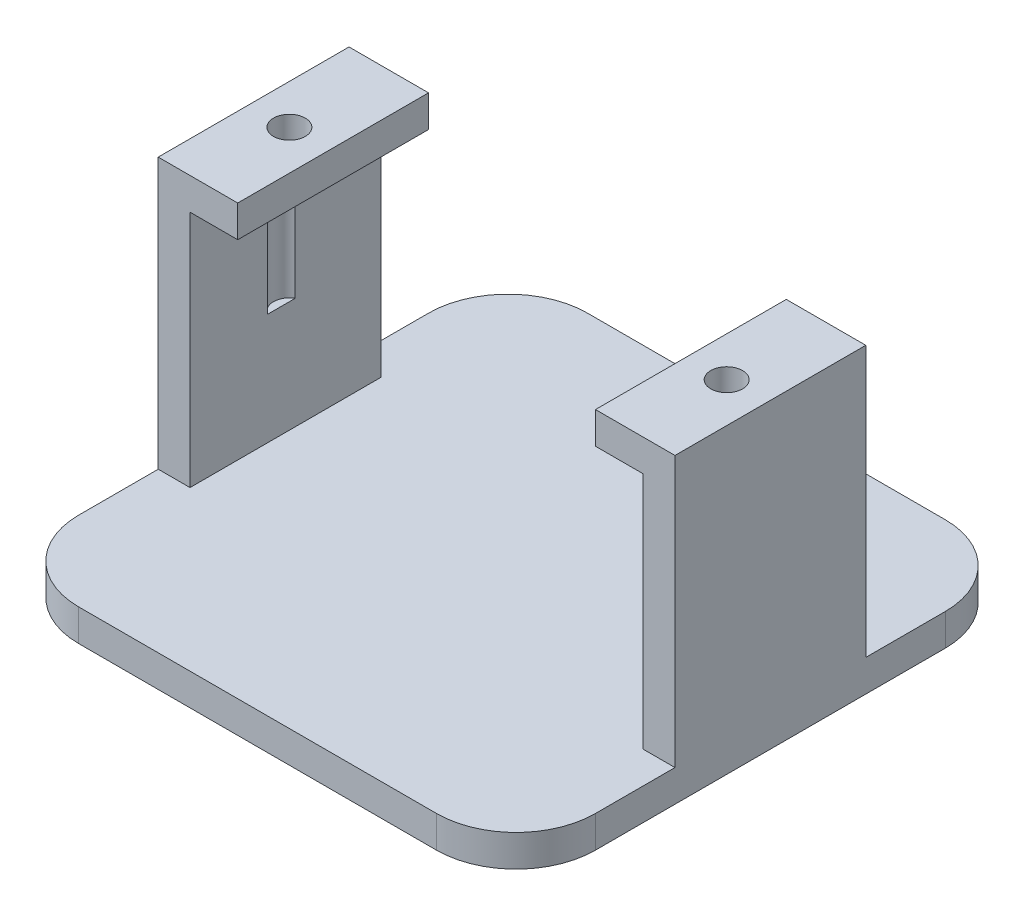
ISO-10303-21;
HEADER;
FILE_DESCRIPTION(('STEP AP214'),'2;1');
FILE_NAME('part.step','',(''),(''),'','','');
FILE_SCHEMA(('AUTOMOTIVE_DESIGN { 1 0 10303 214 1 1 1 1 }'));
ENDSEC;
DATA;
#1=APPLICATION_CONTEXT('core data for automotive mechanical design processes');
#2=APPLICATION_PROTOCOL_DEFINITION('international standard','automotive_design',2000,#1);
#3=PRODUCT_CONTEXT('',#1,'mechanical');
#4=PRODUCT('Part','Part','',(#3));
#5=PRODUCT_RELATED_PRODUCT_CATEGORY('part','',(#4));
#6=PRODUCT_DEFINITION_FORMATION('','',#4);
#7=PRODUCT_DEFINITION_CONTEXT('part definition',#1,'design');
#8=PRODUCT_DEFINITION('design','',#6,#7);
#9=PRODUCT_DEFINITION_SHAPE('','',#8);
#10=(LENGTH_UNIT() NAMED_UNIT(*) SI_UNIT(.MILLI.,.METRE.));
#11=(NAMED_UNIT(*) PLANE_ANGLE_UNIT() SI_UNIT($,.RADIAN.));
#12=(NAMED_UNIT(*) SI_UNIT($,.STERADIAN.) SOLID_ANGLE_UNIT());
#13=UNCERTAINTY_MEASURE_WITH_UNIT(LENGTH_MEASURE(1.E-05),#10,'distance_accuracy_value','');
#14=(GEOMETRIC_REPRESENTATION_CONTEXT(3) GLOBAL_UNCERTAINTY_ASSIGNED_CONTEXT((#13)) GLOBAL_UNIT_ASSIGNED_CONTEXT((#10,
#11,#12)) REPRESENTATION_CONTEXT('',''));
#15=CARTESIAN_POINT('',(0.,0.,0.));
#16=DIRECTION('',(0.,0.,1.));
#17=DIRECTION('',(1.,0.,0.));
#18=AXIS2_PLACEMENT_3D('',#15,#16,#17);
#19=CARTESIAN_POINT('',(0.,2.,0.));
#20=DIRECTION('',(0.,0.,-1.));
#21=DIRECTION('',(-1.,0.,0.));
#22=AXIS2_PLACEMENT_3D('',#19,#20,#21);
#23=PLANE('',#22);
#24=DIRECTION('',(-1.,0.,0.));
#25=VECTOR('',#24,1.);
#26=CARTESIAN_POINT('',(0.,2.,0.));
#27=LINE('',#26,#25);
#28=CARTESIAN_POINT('',(32.5,2.,0.));
#29=VERTEX_POINT('',#28);
#30=CARTESIAN_POINT('',(30.5,2.,0.));
#31=VERTEX_POINT('',#30);
#32=EDGE_CURVE('E222',#29,#31,#27,.T.);
#33=ORIENTED_EDGE('',*,*,#32,.F.);
#34=DIRECTION('',(0.,-1.,0.));
#35=VECTOR('',#34,1.);
#36=CARTESIAN_POINT('',(32.5,2.,0.));
#37=LINE('',#36,#35);
#38=CARTESIAN_POINT('',(32.5,19.,0.));
#39=VERTEX_POINT('',#38);
#40=EDGE_CURVE('E288',#39,#29,#37,.T.);
#41=ORIENTED_EDGE('',*,*,#40,.F.);
#42=DIRECTION('',(1.,0.,0.));
#43=VECTOR('',#42,1.);
#44=CARTESIAN_POINT('',(32.5,19.,0.));
#45=LINE('',#44,#43);
#46=CARTESIAN_POINT('',(27.5,19.,0.));
#47=VERTEX_POINT('',#46);
#48=EDGE_CURVE('E374',#47,#39,#45,.T.);
#49=ORIENTED_EDGE('',*,*,#48,.F.);
#50=DIRECTION('',(0.,1.,0.));
#51=VECTOR('',#50,1.);
#52=CARTESIAN_POINT('',(27.5,19.,0.));
#53=LINE('',#52,#51);
#54=CARTESIAN_POINT('',(27.5,17.,0.));
#55=VERTEX_POINT('',#54);
#56=EDGE_CURVE('E406',#55,#47,#53,.T.);
#57=ORIENTED_EDGE('',*,*,#56,.F.);
#58=DIRECTION('',(1.,0.,0.));
#59=VECTOR('',#58,1.);
#60=CARTESIAN_POINT('',(27.5,17.,0.));
#61=LINE('',#60,#59);
#62=CARTESIAN_POINT('',(30.5,17.,0.));
#63=VERTEX_POINT('',#62);
#64=EDGE_CURVE('E396',#55,#63,#61,.T.);
#65=ORIENTED_EDGE('',*,*,#64,.T.);
#66=DIRECTION('',(0.,-1.,0.));
#67=VECTOR('',#66,1.);
#68=CARTESIAN_POINT('',(30.5,19.,0.));
#69=LINE('',#68,#67);
#70=EDGE_CURVE('E246',#63,#31,#69,.T.);
#71=ORIENTED_EDGE('',*,*,#70,.T.);
#72=EDGE_LOOP('',(#33,#41,#49,#57,#65,#71));
#73=FACE_BOUND('',#72,.T.);
#74=ADVANCED_FACE('F34',(#73),#23,.F.);
#75=CARTESIAN_POINT('',(2.,2.,0.));
#76=VERTEX_POINT('',#75);
#77=CARTESIAN_POINT('',(0.,2.,0.));
#78=VERTEX_POINT('',#77);
#79=EDGE_CURVE('E235',#76,#78,#27,.T.);
#80=ORIENTED_EDGE('',*,*,#79,.F.);
#81=DIRECTION('',(0.,-1.,0.));
#82=VECTOR('',#81,1.);
#83=CARTESIAN_POINT('',(2.,19.,0.));
#84=LINE('',#83,#82);
#85=CARTESIAN_POINT('',(2.,17.,0.));
#86=VERTEX_POINT('',#85);
#87=EDGE_CURVE('E313',#86,#76,#84,.T.);
#88=ORIENTED_EDGE('',*,*,#87,.F.);
#89=DIRECTION('',(-1.,0.,0.));
#90=VECTOR('',#89,1.);
#91=CARTESIAN_POINT('',(5.,17.,0.));
#92=LINE('',#91,#90);
#93=CARTESIAN_POINT('',(5.,17.,0.));
#94=VERTEX_POINT('',#93);
#95=EDGE_CURVE('E285',#94,#86,#92,.T.);
#96=ORIENTED_EDGE('',*,*,#95,.F.);
#97=DIRECTION('',(0.,-1.,0.));
#98=VECTOR('',#97,1.);
#99=CARTESIAN_POINT('',(5.,19.,0.));
#100=LINE('',#99,#98);
#101=CARTESIAN_POINT('',(5.,19.,0.));
#102=VERTEX_POINT('',#101);
#103=EDGE_CURVE('E384',#102,#94,#100,.T.);
#104=ORIENTED_EDGE('',*,*,#103,.F.);
#105=DIRECTION('',(1.,0.,0.));
#106=VECTOR('',#105,1.);
#107=CARTESIAN_POINT('',(0.,19.,0.));
#108=LINE('',#107,#106);
#109=CARTESIAN_POINT('',(0.,19.,0.));
#110=VERTEX_POINT('',#109);
#111=EDGE_CURVE('E346',#110,#102,#108,.T.);
#112=ORIENTED_EDGE('',*,*,#111,.F.);
#113=DIRECTION('',(0.,-1.,0.));
#114=VECTOR('',#113,1.);
#115=CARTESIAN_POINT('',(0.,2.,0.));
#116=LINE('',#115,#114);
#117=EDGE_CURVE('E241',#110,#78,#116,.T.);
#118=ORIENTED_EDGE('',*,*,#117,.T.);
#119=EDGE_LOOP('',(#80,#88,#96,#104,#112,#118));
#120=FACE_BOUND('',#119,.T.);
#121=ADVANCED_FACE('F342',(#120),#23,.F.);
#122=CARTESIAN_POINT('',(0.,2.,-12.));
#123=DIRECTION('',(0.,0.,1.));
#124=DIRECTION('',(1.,0.,0.));
#125=AXIS2_PLACEMENT_3D('',#122,#123,#124);
#126=PLANE('',#125);
#127=DIRECTION('',(1.,0.,0.));
#128=VECTOR('',#127,1.);
#129=CARTESIAN_POINT('',(32.5,2.,-12.));
#130=LINE('',#129,#128);
#131=CARTESIAN_POINT('',(0.,2.,-12.));
#132=VERTEX_POINT('',#131);
#133=CARTESIAN_POINT('',(2.,2.,-12.));
#134=VERTEX_POINT('',#133);
#135=EDGE_CURVE('E257',#132,#134,#130,.T.);
#136=ORIENTED_EDGE('',*,*,#135,.F.);
#137=DIRECTION('',(0.,-1.,0.));
#138=VECTOR('',#137,1.);
#139=CARTESIAN_POINT('',(0.,2.,-12.));
#140=LINE('',#139,#138);
#141=CARTESIAN_POINT('',(0.,19.,-12.));
#142=VERTEX_POINT('',#141);
#143=EDGE_CURVE('E315',#142,#132,#140,.T.);
#144=ORIENTED_EDGE('',*,*,#143,.F.);
#145=DIRECTION('',(-1.,0.,0.));
#146=VECTOR('',#145,1.);
#147=CARTESIAN_POINT('',(0.,19.,-12.));
#148=LINE('',#147,#146);
#149=CARTESIAN_POINT('',(5.,19.,-12.));
#150=VERTEX_POINT('',#149);
#151=EDGE_CURVE('E307',#150,#142,#148,.T.);
#152=ORIENTED_EDGE('',*,*,#151,.F.);
#153=DIRECTION('',(0.,1.,0.));
#154=VECTOR('',#153,1.);
#155=CARTESIAN_POINT('',(5.,19.,-12.));
#156=LINE('',#155,#154);
#157=CARTESIAN_POINT('',(5.,17.,-12.));
#158=VERTEX_POINT('',#157);
#159=EDGE_CURVE('E387',#158,#150,#156,.T.);
#160=ORIENTED_EDGE('',*,*,#159,.F.);
#161=DIRECTION('',(-1.,0.,0.));
#162=VECTOR('',#161,1.);
#163=CARTESIAN_POINT('',(5.,17.,-12.));
#164=LINE('',#163,#162);
#165=CARTESIAN_POINT('',(2.,17.,-12.));
#166=VERTEX_POINT('',#165);
#167=EDGE_CURVE('E380',#158,#166,#164,.T.);
#168=ORIENTED_EDGE('',*,*,#167,.T.);
#169=DIRECTION('',(0.,-1.,0.));
#170=VECTOR('',#169,1.);
#171=CARTESIAN_POINT('',(2.,19.,-12.));
#172=LINE('',#171,#170);
#173=EDGE_CURVE('E360',#166,#134,#172,.T.);
#174=ORIENTED_EDGE('',*,*,#173,.T.);
#175=EDGE_LOOP('',(#136,#144,#152,#160,#168,#174));
#176=FACE_BOUND('',#175,.T.);
#177=ADVANCED_FACE('F495',(#176),#126,.F.);
#178=CARTESIAN_POINT('',(30.5,2.,-12.));
#179=VERTEX_POINT('',#178);
#180=CARTESIAN_POINT('',(32.5,2.,-12.));
#181=VERTEX_POINT('',#180);
#182=EDGE_CURVE('E240',#179,#181,#130,.T.);
#183=ORIENTED_EDGE('',*,*,#182,.F.);
#184=DIRECTION('',(0.,-1.,0.));
#185=VECTOR('',#184,1.);
#186=CARTESIAN_POINT('',(30.5,19.,-12.));
#187=LINE('',#186,#185);
#188=CARTESIAN_POINT('',(30.5,17.,-12.));
#189=VERTEX_POINT('',#188);
#190=EDGE_CURVE('E275',#189,#179,#187,.T.);
#191=ORIENTED_EDGE('',*,*,#190,.F.);
#192=DIRECTION('',(1.,0.,0.));
#193=VECTOR('',#192,1.);
#194=CARTESIAN_POINT('',(27.5,17.,-12.));
#195=LINE('',#194,#193);
#196=CARTESIAN_POINT('',(27.5,17.,-12.));
#197=VERTEX_POINT('',#196);
#198=EDGE_CURVE('E394',#197,#189,#195,.T.);
#199=ORIENTED_EDGE('',*,*,#198,.F.);
#200=DIRECTION('',(0.,-1.,0.));
#201=VECTOR('',#200,1.);
#202=CARTESIAN_POINT('',(27.5,19.,-12.));
#203=LINE('',#202,#201);
#204=CARTESIAN_POINT('',(27.5,19.,-12.));
#205=VERTEX_POINT('',#204);
#206=EDGE_CURVE('E403',#205,#197,#203,.T.);
#207=ORIENTED_EDGE('',*,*,#206,.F.);
#208=DIRECTION('',(-1.,0.,0.));
#209=VECTOR('',#208,1.);
#210=CARTESIAN_POINT('',(32.5,19.,-12.));
#211=LINE('',#210,#209);
#212=CARTESIAN_POINT('',(32.5,19.,-12.));
#213=VERTEX_POINT('',#212);
#214=EDGE_CURVE('E328',#213,#205,#211,.T.);
#215=ORIENTED_EDGE('',*,*,#214,.F.);
#216=DIRECTION('',(0.,-1.,0.));
#217=VECTOR('',#216,1.);
#218=CARTESIAN_POINT('',(32.5,2.,-12.));
#219=LINE('',#218,#217);
#220=EDGE_CURVE('E291',#213,#181,#219,.T.);
#221=ORIENTED_EDGE('',*,*,#220,.T.);
#222=EDGE_LOOP('',(#183,#191,#199,#207,#215,#221));
#223=FACE_BOUND('',#222,.T.);
#224=ADVANCED_FACE('F325',(#223),#126,.F.);
#225=CARTESIAN_POINT('',(30.5,19.,0.));
#226=DIRECTION('',(1.,0.,0.));
#227=DIRECTION('',(0.,0.,-1.));
#228=AXIS2_PLACEMENT_3D('',#225,#226,#227);
#229=PLANE('',#228);
#230=DIRECTION('',(0.,0.,1.));
#231=VECTOR('',#230,1.);
#232=CARTESIAN_POINT('',(30.5,9.,0.));
#233=LINE('',#232,#231);
#234=CARTESIAN_POINT('',(30.5,9.,-6.61602540378444));
#235=VERTEX_POINT('',#234);
#236=CARTESIAN_POINT('',(30.5,9.,-4.88397459621556));
#237=VERTEX_POINT('',#236);
#238=EDGE_CURVE('E11',#235,#237,#233,.T.);
#239=ORIENTED_EDGE('',*,*,#238,.F.);
#240=DIRECTION('',(0.,1.,0.));
#241=VECTOR('',#240,1.);
#242=CARTESIAN_POINT('',(30.5,9.,-6.61602540378444));
#243=LINE('',#242,#241);
#244=CARTESIAN_POINT('',(30.5,17.,-6.61602540378444));
#245=VERTEX_POINT('',#244);
#246=EDGE_CURVE('E201',#235,#245,#243,.T.);
#247=ORIENTED_EDGE('',*,*,#246,.T.);
#248=DIRECTION('',(0.,0.,1.));
#249=VECTOR('',#248,1.);
#250=CARTESIAN_POINT('',(30.5,17.,-12.));
#251=LINE('',#250,#249);
#252=EDGE_CURVE('E400',#189,#245,#251,.T.);
#253=ORIENTED_EDGE('',*,*,#252,.F.);
#254=ORIENTED_EDGE('',*,*,#190,.T.);
#255=DIRECTION('',(0.,0.,1.));
#256=VECTOR('',#255,1.);
#257=CARTESIAN_POINT('',(30.5,2.,0.));
#258=LINE('',#257,#256);
#259=EDGE_CURVE('E281',#179,#31,#258,.T.);
#260=ORIENTED_EDGE('',*,*,#259,.T.);
#261=ORIENTED_EDGE('',*,*,#70,.F.);
#262=CARTESIAN_POINT('',(30.5,17.,-4.88397459621556));
#263=VERTEX_POINT('',#262);
#264=EDGE_CURVE('E207',#263,#63,#251,.T.);
#265=ORIENTED_EDGE('',*,*,#264,.F.);
#266=DIRECTION('',(0.,1.,0.));
#267=VECTOR('',#266,1.);
#268=CARTESIAN_POINT('',(30.5,9.,-4.88397459621556));
#269=LINE('',#268,#267);
#270=EDGE_CURVE('E49',#263,#237,#269,.F.);
#271=ORIENTED_EDGE('',*,*,#270,.T.);
#272=EDGE_LOOP('',(#239,#247,#253,#254,#260,#261,#265,#271));
#273=FACE_BOUND('',#272,.T.);
#274=ADVANCED_FACE('F205',(#273),#229,.F.);
#275=CARTESIAN_POINT('',(2.,19.,0.));
#276=DIRECTION('',(-1.,0.,0.));
#277=DIRECTION('',(0.,0.,1.));
#278=AXIS2_PLACEMENT_3D('',#275,#276,#277);
#279=PLANE('',#278);
#280=DIRECTION('',(0.,0.,-1.));
#281=VECTOR('',#280,1.);
#282=CARTESIAN_POINT('',(2.,9.,0.));
#283=LINE('',#282,#281);
#284=CARTESIAN_POINT('',(2.,9.,-4.88397459621556));
#285=VERTEX_POINT('',#284);
#286=CARTESIAN_POINT('',(2.,9.,-6.61602540378444));
#287=VERTEX_POINT('',#286);
#288=EDGE_CURVE('E443',#285,#287,#283,.T.);
#289=ORIENTED_EDGE('',*,*,#288,.F.);
#290=DIRECTION('',(0.,1.,0.));
#291=VECTOR('',#290,1.);
#292=CARTESIAN_POINT('',(2.,9.,-4.88397459621556));
#293=LINE('',#292,#291);
#294=CARTESIAN_POINT('',(2.,17.,-4.88397459621556));
#295=VERTEX_POINT('',#294);
#296=EDGE_CURVE('E219',#285,#295,#293,.T.);
#297=ORIENTED_EDGE('',*,*,#296,.T.);
#298=DIRECTION('',(0.,0.,-1.));
#299=VECTOR('',#298,1.);
#300=CARTESIAN_POINT('',(2.,17.,0.));
#301=LINE('',#300,#299);
#302=EDGE_CURVE('E363',#86,#295,#301,.T.);
#303=ORIENTED_EDGE('',*,*,#302,.F.);
#304=ORIENTED_EDGE('',*,*,#87,.T.);
#305=DIRECTION('',(0.,0.,-1.));
#306=VECTOR('',#305,1.);
#307=CARTESIAN_POINT('',(2.,2.,0.));
#308=LINE('',#307,#306);
#309=EDGE_CURVE('E278',#76,#134,#308,.T.);
#310=ORIENTED_EDGE('',*,*,#309,.T.);
#311=ORIENTED_EDGE('',*,*,#173,.F.);
#312=CARTESIAN_POINT('',(2.,17.,-6.61602540378444));
#313=VERTEX_POINT('',#312);
#314=EDGE_CURVE('E385',#313,#166,#301,.T.);
#315=ORIENTED_EDGE('',*,*,#314,.F.);
#316=DIRECTION('',(0.,1.,0.));
#317=VECTOR('',#316,1.);
#318=CARTESIAN_POINT('',(2.,9.,-6.61602540378444));
#319=LINE('',#318,#317);
#320=EDGE_CURVE('E57',#313,#287,#319,.F.);
#321=ORIENTED_EDGE('',*,*,#320,.T.);
#322=EDGE_LOOP('',(#289,#297,#303,#304,#310,#311,#315,#321));
#323=FACE_BOUND('',#322,.T.);
#324=ADVANCED_FACE('F358',(#323),#279,.F.);
#325=CARTESIAN_POINT('',(0.,2.,0.));
#326=DIRECTION('',(0.,-1.,0.));
#327=DIRECTION('',(0.,0.,-1.));
#328=AXIS2_PLACEMENT_3D('',#325,#326,#327);
#329=PLANE('',#328);
#330=DIRECTION('',(-1.,0.,0.));
#331=VECTOR('',#330,1.);
#332=CARTESIAN_POINT('',(0.,2.,10.));
#333=LINE('',#332,#331);
#334=CARTESIAN_POINT('',(27.5,2.,10.));
#335=VERTEX_POINT('',#334);
#336=CARTESIAN_POINT('',(5.,2.,10.));
#337=VERTEX_POINT('',#336);
#338=EDGE_CURVE('E226',#335,#337,#333,.T.);
#339=ORIENTED_EDGE('',*,*,#338,.F.);
#340=CARTESIAN_POINT('',(27.5,2.,5.));
#341=DIRECTION('',(0.,-1.,0.));
#342=DIRECTION('',(0.,0.,-1.));
#343=AXIS2_PLACEMENT_3D('',#340,#341,#342);
#344=CIRCLE('',#343,5.);
#345=CARTESIAN_POINT('',(32.5,2.,5.));
#346=VERTEX_POINT('',#345);
#347=EDGE_CURVE('E460',#335,#346,#344,.F.);
#348=ORIENTED_EDGE('',*,*,#347,.T.);
#349=DIRECTION('',(0.,0.,-1.));
#350=VECTOR('',#349,1.);
#351=CARTESIAN_POINT('',(32.5,2.,10.));
#352=LINE('',#351,#350);
#353=EDGE_CURVE('E251',#346,#29,#352,.T.);
#354=ORIENTED_EDGE('',*,*,#353,.T.);
#355=ORIENTED_EDGE('',*,*,#32,.T.);
#356=ORIENTED_EDGE('',*,*,#259,.F.);
#357=ORIENTED_EDGE('',*,*,#182,.T.);
#358=DIRECTION('',(0.,0.,1.));
#359=VECTOR('',#358,1.);
#360=CARTESIAN_POINT('',(32.5,2.,-22.));
#361=LINE('',#360,#359);
#362=CARTESIAN_POINT('',(32.5,2.,-17.));
#363=VERTEX_POINT('',#362);
#364=EDGE_CURVE('E267',#363,#181,#361,.T.);
#365=ORIENTED_EDGE('',*,*,#364,.F.);
#366=CARTESIAN_POINT('',(27.5,2.,-17.));
#367=DIRECTION('',(0.,-1.,0.));
#368=DIRECTION('',(0.,0.,-1.));
#369=AXIS2_PLACEMENT_3D('',#366,#367,#368);
#370=CIRCLE('',#369,5.);
#371=CARTESIAN_POINT('',(27.5,2.,-22.));
#372=VERTEX_POINT('',#371);
#373=EDGE_CURVE('E468',#363,#372,#370,.F.);
#374=ORIENTED_EDGE('',*,*,#373,.T.);
#375=DIRECTION('',(1.,0.,0.));
#376=VECTOR('',#375,1.);
#377=CARTESIAN_POINT('',(32.5,2.,-22.));
#378=LINE('',#377,#376);
#379=CARTESIAN_POINT('',(5.,2.,-22.));
#380=VERTEX_POINT('',#379);
#381=EDGE_CURVE('E269',#380,#372,#378,.T.);
#382=ORIENTED_EDGE('',*,*,#381,.F.);
#383=CARTESIAN_POINT('',(5.,2.,-17.));
#384=DIRECTION('',(0.,-1.,0.));
#385=DIRECTION('',(0.,0.,-1.));
#386=AXIS2_PLACEMENT_3D('',#383,#384,#385);
#387=CIRCLE('',#386,5.);
#388=CARTESIAN_POINT('',(0.,2.,-17.));
#389=VERTEX_POINT('',#388);
#390=EDGE_CURVE('E258',#380,#389,#387,.F.);
#391=ORIENTED_EDGE('',*,*,#390,.T.);
#392=DIRECTION('',(0.,0.,1.));
#393=VECTOR('',#392,1.);
#394=CARTESIAN_POINT('',(0.,2.,-22.));
#395=LINE('',#394,#393);
#396=EDGE_CURVE('E252',#389,#132,#395,.T.);
#397=ORIENTED_EDGE('',*,*,#396,.T.);
#398=ORIENTED_EDGE('',*,*,#135,.T.);
#399=ORIENTED_EDGE('',*,*,#309,.F.);
#400=ORIENTED_EDGE('',*,*,#79,.T.);
#401=DIRECTION('',(0.,0.,-1.));
#402=VECTOR('',#401,1.);
#403=CARTESIAN_POINT('',(0.,2.,10.));
#404=LINE('',#403,#402);
#405=CARTESIAN_POINT('',(0.,2.,5.));
#406=VERTEX_POINT('',#405);
#407=EDGE_CURVE('E229',#406,#78,#404,.T.);
#408=ORIENTED_EDGE('',*,*,#407,.F.);
#409=CARTESIAN_POINT('',(5.,2.,5.));
#410=DIRECTION('',(0.,-1.,0.));
#411=DIRECTION('',(0.,0.,-1.));
#412=AXIS2_PLACEMENT_3D('',#409,#410,#411);
#413=CIRCLE('',#412,5.);
#414=EDGE_CURVE('E464',#406,#337,#413,.F.);
#415=ORIENTED_EDGE('',*,*,#414,.T.);
#416=EDGE_LOOP('',(#339,#348,#354,#355,#356,#357,#365,#374,#382,#391,#397,#398,#399,#400,#408,#415));
#417=FACE_BOUND('',#416,.T.);
#418=ADVANCED_FACE('F336',(#417),#329,.F.);
#419=CARTESIAN_POINT('',(0.,2.,0.));
#420=DIRECTION('',(1.,0.,0.));
#421=DIRECTION('',(0.,0.,-1.));
#422=AXIS2_PLACEMENT_3D('',#419,#420,#421);
#423=PLANE('',#422);
#424=DIRECTION('',(0.,0.,1.));
#425=VECTOR('',#424,1.);
#426=CARTESIAN_POINT('',(0.,0.,0.));
#427=LINE('',#426,#425);
#428=CARTESIAN_POINT('',(0.,0.,-17.));
#429=VERTEX_POINT('',#428);
#430=CARTESIAN_POINT('',(0.,0.,5.));
#431=VERTEX_POINT('',#430);
#432=EDGE_CURVE('E309',#429,#431,#427,.T.);
#433=ORIENTED_EDGE('',*,*,#432,.T.);
#434=DIRECTION('',(0.,-1.,0.));
#435=VECTOR('',#434,1.);
#436=CARTESIAN_POINT('',(0.,2.,5.));
#437=LINE('',#436,#435);
#438=EDGE_CURVE('E434',#431,#406,#437,.F.);
#439=ORIENTED_EDGE('',*,*,#438,.T.);
#440=ORIENTED_EDGE('',*,*,#407,.T.);
#441=ORIENTED_EDGE('',*,*,#117,.F.);
#442=DIRECTION('',(0.,0.,1.));
#443=VECTOR('',#442,1.);
#444=CARTESIAN_POINT('',(0.,19.,0.));
#445=LINE('',#444,#443);
#446=EDGE_CURVE('E301',#142,#110,#445,.T.);
#447=ORIENTED_EDGE('',*,*,#446,.F.);
#448=ORIENTED_EDGE('',*,*,#143,.T.);
#449=ORIENTED_EDGE('',*,*,#396,.F.);
#450=DIRECTION('',(0.,1.,0.));
#451=VECTOR('',#450,1.);
#452=CARTESIAN_POINT('',(0.,0.,-17.));
#453=LINE('',#452,#451);
#454=EDGE_CURVE('E438',#389,#429,#453,.F.);
#455=ORIENTED_EDGE('',*,*,#454,.T.);
#456=EDGE_LOOP('',(#433,#439,#440,#441,#447,#448,#449,#455));
#457=FACE_BOUND('',#456,.T.);
#458=ADVANCED_FACE('F480',(#457),#423,.F.);
#459=CARTESIAN_POINT('',(32.5,2.,0.));
#460=DIRECTION('',(-1.,0.,0.));
#461=DIRECTION('',(0.,0.,1.));
#462=AXIS2_PLACEMENT_3D('',#459,#460,#461);
#463=PLANE('',#462);
#464=ORIENTED_EDGE('',*,*,#353,.F.);
#465=DIRECTION('',(0.,1.,0.));
#466=VECTOR('',#465,1.);
#467=CARTESIAN_POINT('',(32.5,0.,5.));
#468=LINE('',#467,#466);
#469=CARTESIAN_POINT('',(32.5,0.,5.));
#470=VERTEX_POINT('',#469);
#471=EDGE_CURVE('E466',#346,#470,#468,.F.);
#472=ORIENTED_EDGE('',*,*,#471,.T.);
#473=DIRECTION('',(0.,0.,-1.));
#474=VECTOR('',#473,1.);
#475=CARTESIAN_POINT('',(32.5,0.,0.));
#476=LINE('',#475,#474);
#477=CARTESIAN_POINT('',(32.5,0.,-17.));
#478=VERTEX_POINT('',#477);
#479=EDGE_CURVE('E312',#470,#478,#476,.T.);
#480=ORIENTED_EDGE('',*,*,#479,.T.);
#481=DIRECTION('',(0.,-1.,0.));
#482=VECTOR('',#481,1.);
#483=CARTESIAN_POINT('',(32.5,2.,-17.));
#484=LINE('',#483,#482);
#485=EDGE_CURVE('E463',#478,#363,#484,.F.);
#486=ORIENTED_EDGE('',*,*,#485,.T.);
#487=ORIENTED_EDGE('',*,*,#364,.T.);
#488=ORIENTED_EDGE('',*,*,#220,.F.);
#489=DIRECTION('',(0.,0.,-1.));
#490=VECTOR('',#489,1.);
#491=CARTESIAN_POINT('',(32.5,19.,0.));
#492=LINE('',#491,#490);
#493=EDGE_CURVE('E284',#39,#213,#492,.T.);
#494=ORIENTED_EDGE('',*,*,#493,.F.);
#495=ORIENTED_EDGE('',*,*,#40,.T.);
#496=EDGE_LOOP('',(#464,#472,#480,#486,#487,#488,#494,#495));
#497=FACE_BOUND('',#496,.T.);
#498=ADVANCED_FACE('F456',(#497),#463,.F.);
#499=CARTESIAN_POINT('',(0.,0.,0.));
#500=DIRECTION('',(0.,-1.,0.));
#501=DIRECTION('',(0.,0.,-1.));
#502=AXIS2_PLACEMENT_3D('',#499,#500,#501);
#503=PLANE('',#502);
#504=ORIENTED_EDGE('',*,*,#479,.F.);
#505=CARTESIAN_POINT('',(27.5,0.,5.));
#506=DIRECTION('',(0.,-1.,0.));
#507=DIRECTION('',(0.,0.,-1.));
#508=AXIS2_PLACEMENT_3D('',#505,#506,#507);
#509=CIRCLE('',#508,5.);
#510=CARTESIAN_POINT('',(27.5,0.,10.));
#511=VERTEX_POINT('',#510);
#512=EDGE_CURVE('E477',#470,#511,#509,.T.);
#513=ORIENTED_EDGE('',*,*,#512,.T.);
#514=DIRECTION('',(1.,0.,0.));
#515=VECTOR('',#514,1.);
#516=CARTESIAN_POINT('',(0.,0.,10.));
#517=LINE('',#516,#515);
#518=CARTESIAN_POINT('',(5.,0.,10.));
#519=VERTEX_POINT('',#518);
#520=EDGE_CURVE('E223',#519,#511,#517,.T.);
#521=ORIENTED_EDGE('',*,*,#520,.F.);
#522=CARTESIAN_POINT('',(5.,0.,5.));
#523=DIRECTION('',(0.,-1.,0.));
#524=DIRECTION('',(0.,0.,-1.));
#525=AXIS2_PLACEMENT_3D('',#522,#523,#524);
#526=CIRCLE('',#525,5.);
#527=EDGE_CURVE('E475',#519,#431,#526,.T.);
#528=ORIENTED_EDGE('',*,*,#527,.T.);
#529=ORIENTED_EDGE('',*,*,#432,.F.);
#530=CARTESIAN_POINT('',(5.,0.,-17.));
#531=DIRECTION('',(0.,-1.,0.));
#532=DIRECTION('',(0.,0.,-1.));
#533=AXIS2_PLACEMENT_3D('',#530,#531,#532);
#534=CIRCLE('',#533,5.);
#535=CARTESIAN_POINT('',(5.,0.,-22.));
#536=VERTEX_POINT('',#535);
#537=EDGE_CURVE('E433',#429,#536,#534,.T.);
#538=ORIENTED_EDGE('',*,*,#537,.T.);
#539=DIRECTION('',(-1.,0.,0.));
#540=VECTOR('',#539,1.);
#541=CARTESIAN_POINT('',(32.5,0.,-22.));
#542=LINE('',#541,#540);
#543=CARTESIAN_POINT('',(27.5,0.,-22.));
#544=VERTEX_POINT('',#543);
#545=EDGE_CURVE('E413',#544,#536,#542,.T.);
#546=ORIENTED_EDGE('',*,*,#545,.F.);
#547=CARTESIAN_POINT('',(27.5,0.,-17.));
#548=DIRECTION('',(0.,-1.,0.));
#549=DIRECTION('',(0.,0.,-1.));
#550=AXIS2_PLACEMENT_3D('',#547,#548,#549);
#551=CIRCLE('',#550,5.);
#552=EDGE_CURVE('E473',#544,#478,#551,.T.);
#553=ORIENTED_EDGE('',*,*,#552,.T.);
#554=EDGE_LOOP('',(#504,#513,#521,#528,#529,#538,#546,#553));
#555=FACE_BOUND('',#554,.T.);
#556=ADVANCED_FACE('F483',(#555),#503,.T.);
#557=CARTESIAN_POINT('',(0.,19.,0.));
#558=DIRECTION('',(0.,-1.,0.));
#559=DIRECTION('',(0.,0.,-1.));
#560=AXIS2_PLACEMENT_3D('',#557,#558,#559);
#561=PLANE('',#560);
#562=CARTESIAN_POINT('',(2.5,19.,-5.75));
#563=DIRECTION('',(0.,1.,0.));
#564=DIRECTION('',(0.,0.,1.));
#565=AXIS2_PLACEMENT_3D('',#562,#563,#564);
#566=CIRCLE('',#565,1.);
#567=CARTESIAN_POINT('',(2.5,19.,-4.75));
#568=VERTEX_POINT('',#567);
#569=EDGE_CURVE('E209',#568,#568,#566,.T.);
#570=ORIENTED_EDGE('',*,*,#569,.F.);
#571=EDGE_LOOP('',(#570));
#572=FACE_BOUND('',#571,.T.);
#573=ORIENTED_EDGE('',*,*,#446,.T.);
#574=ORIENTED_EDGE('',*,*,#111,.T.);
#575=DIRECTION('',(0.,0.,1.));
#576=VECTOR('',#575,1.);
#577=CARTESIAN_POINT('',(5.,19.,0.));
#578=LINE('',#577,#576);
#579=EDGE_CURVE('E382',#150,#102,#578,.T.);
#580=ORIENTED_EDGE('',*,*,#579,.F.);
#581=ORIENTED_EDGE('',*,*,#151,.T.);
#582=EDGE_LOOP('',(#573,#574,#580,#581));
#583=FACE_BOUND('',#582,.T.);
#584=ADVANCED_FACE('F496',(#572,#583),#561,.F.);
#585=CARTESIAN_POINT('',(0.,19.,0.));
#586=DIRECTION('',(0.,1.,0.));
#587=DIRECTION('',(0.,0.,1.));
#588=AXIS2_PLACEMENT_3D('',#585,#586,#587);
#589=PLANE('',#588);
#590=CARTESIAN_POINT('',(30.,19.,-5.75));
#591=DIRECTION('',(0.,1.,0.));
#592=DIRECTION('',(0.,0.,1.));
#593=AXIS2_PLACEMENT_3D('',#590,#591,#592);
#594=CIRCLE('',#593,1.);
#595=CARTESIAN_POINT('',(30.,19.,-4.75));
#596=VERTEX_POINT('',#595);
#597=EDGE_CURVE('E202',#596,#596,#594,.T.);
#598=ORIENTED_EDGE('',*,*,#597,.F.);
#599=EDGE_LOOP('',(#598));
#600=FACE_BOUND('',#599,.T.);
#601=ORIENTED_EDGE('',*,*,#493,.T.);
#602=ORIENTED_EDGE('',*,*,#214,.T.);
#603=DIRECTION('',(0.,0.,-1.));
#604=VECTOR('',#603,1.);
#605=CARTESIAN_POINT('',(27.5,19.,-12.));
#606=LINE('',#605,#604);
#607=EDGE_CURVE('E399',#47,#205,#606,.T.);
#608=ORIENTED_EDGE('',*,*,#607,.F.);
#609=ORIENTED_EDGE('',*,*,#48,.T.);
#610=EDGE_LOOP('',(#601,#602,#608,#609));
#611=FACE_BOUND('',#610,.T.);
#612=ADVANCED_FACE('F454',(#600,#611),#589,.T.);
#613=CARTESIAN_POINT('',(5.,17.,0.));
#614=DIRECTION('',(0.,1.,0.));
#615=DIRECTION('',(0.,0.,1.));
#616=AXIS2_PLACEMENT_3D('',#613,#614,#615);
#617=PLANE('',#616);
#618=ORIENTED_EDGE('',*,*,#302,.T.);
#619=CARTESIAN_POINT('',(2.5,17.,-5.75));
#620=DIRECTION('',(0.,1.,0.));
#621=DIRECTION('',(0.,0.,1.));
#622=AXIS2_PLACEMENT_3D('',#619,#620,#621);
#623=CIRCLE('',#622,1.);
#624=EDGE_CURVE('E436',#295,#313,#623,.T.);
#625=ORIENTED_EDGE('',*,*,#624,.T.);
#626=ORIENTED_EDGE('',*,*,#314,.T.);
#627=ORIENTED_EDGE('',*,*,#167,.F.);
#628=DIRECTION('',(0.,0.,-1.));
#629=VECTOR('',#628,1.);
#630=CARTESIAN_POINT('',(5.,17.,0.));
#631=LINE('',#630,#629);
#632=EDGE_CURVE('E390',#94,#158,#631,.T.);
#633=ORIENTED_EDGE('',*,*,#632,.F.);
#634=ORIENTED_EDGE('',*,*,#95,.T.);
#635=EDGE_LOOP('',(#618,#625,#626,#627,#633,#634));
#636=FACE_BOUND('',#635,.T.);
#637=ADVANCED_FACE('F504',(#636),#617,.F.);
#638=CARTESIAN_POINT('',(5.,0.,0.));
#639=DIRECTION('',(1.,0.,0.));
#640=DIRECTION('',(0.,0.,-1.));
#641=AXIS2_PLACEMENT_3D('',#638,#639,#640);
#642=PLANE('',#641);
#643=ORIENTED_EDGE('',*,*,#103,.T.);
#644=ORIENTED_EDGE('',*,*,#632,.T.);
#645=ORIENTED_EDGE('',*,*,#159,.T.);
#646=ORIENTED_EDGE('',*,*,#579,.T.);
#647=EDGE_LOOP('',(#643,#644,#645,#646));
#648=FACE_BOUND('',#647,.T.);
#649=ADVANCED_FACE('F551',(#648),#642,.T.);
#650=CARTESIAN_POINT('',(27.5,17.,-12.));
#651=DIRECTION('',(0.,1.,0.));
#652=DIRECTION('',(0.,0.,1.));
#653=AXIS2_PLACEMENT_3D('',#650,#651,#652);
#654=PLANE('',#653);
#655=ORIENTED_EDGE('',*,*,#252,.T.);
#656=CARTESIAN_POINT('',(30.,17.,-5.75));
#657=DIRECTION('',(0.,1.,0.));
#658=DIRECTION('',(0.,0.,1.));
#659=AXIS2_PLACEMENT_3D('',#656,#657,#658);
#660=CIRCLE('',#659,1.);
#661=EDGE_CURVE('E42',#245,#263,#660,.T.);
#662=ORIENTED_EDGE('',*,*,#661,.T.);
#663=ORIENTED_EDGE('',*,*,#264,.T.);
#664=ORIENTED_EDGE('',*,*,#64,.F.);
#665=DIRECTION('',(0.,0.,1.));
#666=VECTOR('',#665,1.);
#667=CARTESIAN_POINT('',(27.5,17.,-12.));
#668=LINE('',#667,#666);
#669=EDGE_CURVE('E409',#197,#55,#668,.T.);
#670=ORIENTED_EDGE('',*,*,#669,.F.);
#671=ORIENTED_EDGE('',*,*,#198,.T.);
#672=EDGE_LOOP('',(#655,#662,#663,#664,#670,#671));
#673=FACE_BOUND('',#672,.T.);
#674=ADVANCED_FACE('F445',(#673),#654,.F.);
#675=CARTESIAN_POINT('',(27.5,0.,0.));
#676=DIRECTION('',(-1.,0.,0.));
#677=DIRECTION('',(0.,0.,1.));
#678=AXIS2_PLACEMENT_3D('',#675,#676,#677);
#679=PLANE('',#678);
#680=ORIENTED_EDGE('',*,*,#206,.T.);
#681=ORIENTED_EDGE('',*,*,#669,.T.);
#682=ORIENTED_EDGE('',*,*,#56,.T.);
#683=ORIENTED_EDGE('',*,*,#607,.T.);
#684=EDGE_LOOP('',(#680,#681,#682,#683));
#685=FACE_BOUND('',#684,.T.);
#686=ADVANCED_FACE('F451',(#685),#679,.T.);
#687=CARTESIAN_POINT('',(0.,0.,-22.));
#688=DIRECTION('',(0.,0.,-1.));
#689=DIRECTION('',(-1.,0.,0.));
#690=AXIS2_PLACEMENT_3D('',#687,#688,#689);
#691=PLANE('',#690);
#692=ORIENTED_EDGE('',*,*,#381,.T.);
#693=DIRECTION('',(0.,-1.,0.));
#694=VECTOR('',#693,1.);
#695=CARTESIAN_POINT('',(27.5,0.,-22.));
#696=LINE('',#695,#694);
#697=EDGE_CURVE('E428',#372,#544,#696,.T.);
#698=ORIENTED_EDGE('',*,*,#697,.T.);
#699=ORIENTED_EDGE('',*,*,#545,.T.);
#700=DIRECTION('',(0.,1.,0.));
#701=VECTOR('',#700,1.);
#702=CARTESIAN_POINT('',(5.,2.,-22.));
#703=LINE('',#702,#701);
#704=EDGE_CURVE('E425',#536,#380,#703,.T.);
#705=ORIENTED_EDGE('',*,*,#704,.T.);
#706=EDGE_LOOP('',(#692,#698,#699,#705));
#707=FACE_BOUND('',#706,.T.);
#708=ADVANCED_FACE('F424',(#707),#691,.T.);
#709=CARTESIAN_POINT('',(0.,0.,10.));
#710=DIRECTION('',(0.,0.,1.));
#711=DIRECTION('',(1.,0.,0.));
#712=AXIS2_PLACEMENT_3D('',#709,#710,#711);
#713=PLANE('',#712);
#714=ORIENTED_EDGE('',*,*,#520,.T.);
#715=DIRECTION('',(0.,1.,0.));
#716=VECTOR('',#715,1.);
#717=CARTESIAN_POINT('',(27.5,2.,10.));
#718=LINE('',#717,#716);
#719=EDGE_CURVE('E265',#511,#335,#718,.T.);
#720=ORIENTED_EDGE('',*,*,#719,.T.);
#721=ORIENTED_EDGE('',*,*,#338,.T.);
#722=DIRECTION('',(0.,-1.,0.));
#723=VECTOR('',#722,1.);
#724=CARTESIAN_POINT('',(5.,0.,10.));
#725=LINE('',#724,#723);
#726=EDGE_CURVE('E239',#337,#519,#725,.T.);
#727=ORIENTED_EDGE('',*,*,#726,.T.);
#728=EDGE_LOOP('',(#714,#720,#721,#727));
#729=FACE_BOUND('',#728,.T.);
#730=ADVANCED_FACE('F489',(#729),#713,.T.);
#731=CARTESIAN_POINT('',(27.5,0.,5.));
#732=DIRECTION('',(0.,-1.,0.));
#733=DIRECTION('',(0.,0.,-1.));
#734=AXIS2_PLACEMENT_3D('',#731,#732,#733);
#735=CYLINDRICAL_SURFACE('',#734,5.);
#736=ORIENTED_EDGE('',*,*,#512,.F.);
#737=ORIENTED_EDGE('',*,*,#471,.F.);
#738=ORIENTED_EDGE('',*,*,#347,.F.);
#739=ORIENTED_EDGE('',*,*,#719,.F.);
#740=EDGE_LOOP('',(#736,#737,#738,#739));
#741=FACE_BOUND('',#740,.T.);
#742=ADVANCED_FACE('F491',(#741),#735,.T.);
#743=CARTESIAN_POINT('',(5.,0.,5.));
#744=DIRECTION('',(0.,1.,0.));
#745=DIRECTION('',(0.,0.,1.));
#746=AXIS2_PLACEMENT_3D('',#743,#744,#745);
#747=CYLINDRICAL_SURFACE('',#746,5.);
#748=ORIENTED_EDGE('',*,*,#414,.F.);
#749=ORIENTED_EDGE('',*,*,#438,.F.);
#750=ORIENTED_EDGE('',*,*,#527,.F.);
#751=ORIENTED_EDGE('',*,*,#726,.F.);
#752=EDGE_LOOP('',(#748,#749,#750,#751));
#753=FACE_BOUND('',#752,.T.);
#754=ADVANCED_FACE('F487',(#753),#747,.T.);
#755=CARTESIAN_POINT('',(27.5,0.,-17.));
#756=DIRECTION('',(0.,1.,0.));
#757=DIRECTION('',(0.,0.,1.));
#758=AXIS2_PLACEMENT_3D('',#755,#756,#757);
#759=CYLINDRICAL_SURFACE('',#758,5.);
#760=ORIENTED_EDGE('',*,*,#373,.F.);
#761=ORIENTED_EDGE('',*,*,#485,.F.);
#762=ORIENTED_EDGE('',*,*,#552,.F.);
#763=ORIENTED_EDGE('',*,*,#697,.F.);
#764=EDGE_LOOP('',(#760,#761,#762,#763));
#765=FACE_BOUND('',#764,.T.);
#766=ADVANCED_FACE('F494',(#765),#759,.T.);
#767=CARTESIAN_POINT('',(5.,0.,-17.));
#768=DIRECTION('',(0.,-1.,0.));
#769=DIRECTION('',(0.,0.,-1.));
#770=AXIS2_PLACEMENT_3D('',#767,#768,#769);
#771=CYLINDRICAL_SURFACE('',#770,5.);
#772=ORIENTED_EDGE('',*,*,#537,.F.);
#773=ORIENTED_EDGE('',*,*,#454,.F.);
#774=ORIENTED_EDGE('',*,*,#390,.F.);
#775=ORIENTED_EDGE('',*,*,#704,.F.);
#776=EDGE_LOOP('',(#772,#773,#774,#775));
#777=FACE_BOUND('',#776,.T.);
#778=ADVANCED_FACE('F36',(#777),#771,.T.);
#779=CARTESIAN_POINT('',(2.5,9.,-5.75));
#780=DIRECTION('',(0.,1.,0.));
#781=DIRECTION('',(0.,0.,1.));
#782=AXIS2_PLACEMENT_3D('',#779,#780,#781);
#783=PLANE('',#782);
#784=ORIENTED_EDGE('',*,*,#288,.T.);
#785=CARTESIAN_POINT('',(2.5,9.,-5.75));
#786=DIRECTION('',(0.,1.,0.));
#787=DIRECTION('',(0.,0.,1.));
#788=AXIS2_PLACEMENT_3D('',#785,#786,#787);
#789=CIRCLE('',#788,1.);
#790=EDGE_CURVE('E213',#287,#285,#789,.T.);
#791=ORIENTED_EDGE('',*,*,#790,.T.);
#792=EDGE_LOOP('',(#784,#791));
#793=FACE_BOUND('',#792,.T.);
#794=ADVANCED_FACE('F528',(#793),#783,.T.);
#795=CARTESIAN_POINT('',(2.5,9.,-5.75));
#796=DIRECTION('',(0.,1.,0.));
#797=DIRECTION('',(0.,0.,1.));
#798=AXIS2_PLACEMENT_3D('',#795,#796,#797);
#799=CYLINDRICAL_SURFACE('',#798,1.);
#800=ORIENTED_EDGE('',*,*,#569,.T.);
#801=EDGE_LOOP('',(#800));
#802=FACE_BOUND('',#801,.T.);
#803=ORIENTED_EDGE('',*,*,#790,.F.);
#804=ORIENTED_EDGE('',*,*,#320,.F.);
#805=ORIENTED_EDGE('',*,*,#624,.F.);
#806=ORIENTED_EDGE('',*,*,#296,.F.);
#807=EDGE_LOOP('',(#803,#804,#805,#806));
#808=FACE_BOUND('',#807,.T.);
#809=ADVANCED_FACE('F532',(#802,#808),#799,.F.);
#810=CARTESIAN_POINT('',(30.,9.,-5.75));
#811=DIRECTION('',(0.,1.,0.));
#812=DIRECTION('',(0.,0.,1.));
#813=AXIS2_PLACEMENT_3D('',#810,#811,#812);
#814=PLANE('',#813);
#815=ORIENTED_EDGE('',*,*,#238,.T.);
#816=CARTESIAN_POINT('',(30.,9.,-5.75));
#817=DIRECTION('',(0.,1.,0.));
#818=DIRECTION('',(0.,0.,1.));
#819=AXIS2_PLACEMENT_3D('',#816,#817,#818);
#820=CIRCLE('',#819,1.);
#821=EDGE_CURVE('E197',#237,#235,#820,.T.);
#822=ORIENTED_EDGE('',*,*,#821,.T.);
#823=EDGE_LOOP('',(#815,#822));
#824=FACE_BOUND('',#823,.T.);
#825=ADVANCED_FACE('F196',(#824),#814,.T.);
#826=CARTESIAN_POINT('',(30.,9.,-5.75));
#827=DIRECTION('',(0.,1.,0.));
#828=DIRECTION('',(0.,0.,1.));
#829=AXIS2_PLACEMENT_3D('',#826,#827,#828);
#830=CYLINDRICAL_SURFACE('',#829,1.);
#831=ORIENTED_EDGE('',*,*,#597,.T.);
#832=EDGE_LOOP('',(#831));
#833=FACE_BOUND('',#832,.T.);
#834=ORIENTED_EDGE('',*,*,#821,.F.);
#835=ORIENTED_EDGE('',*,*,#270,.F.);
#836=ORIENTED_EDGE('',*,*,#661,.F.);
#837=ORIENTED_EDGE('',*,*,#246,.F.);
#838=EDGE_LOOP('',(#834,#835,#836,#837));
#839=FACE_BOUND('',#838,.T.);
#840=ADVANCED_FACE('F200',(#833,#839),#830,.F.);
#841=CLOSED_SHELL('',(#74,#121,#177,#224,#274,#324,#418,#458,#498,#556,#584,#612,#637,#649,#674,
#686,#708,#730,#742,#754,#766,#778,#794,#809,#825,#840));
#842=MANIFOLD_SOLID_BREP('B2',#841);
#843=ADVANCED_BREP_SHAPE_REPRESENTATION('',(#18,#842),#14);
#844=SHAPE_DEFINITION_REPRESENTATION(#9,#843);
ENDSEC;
END-ISO-10303-21;
